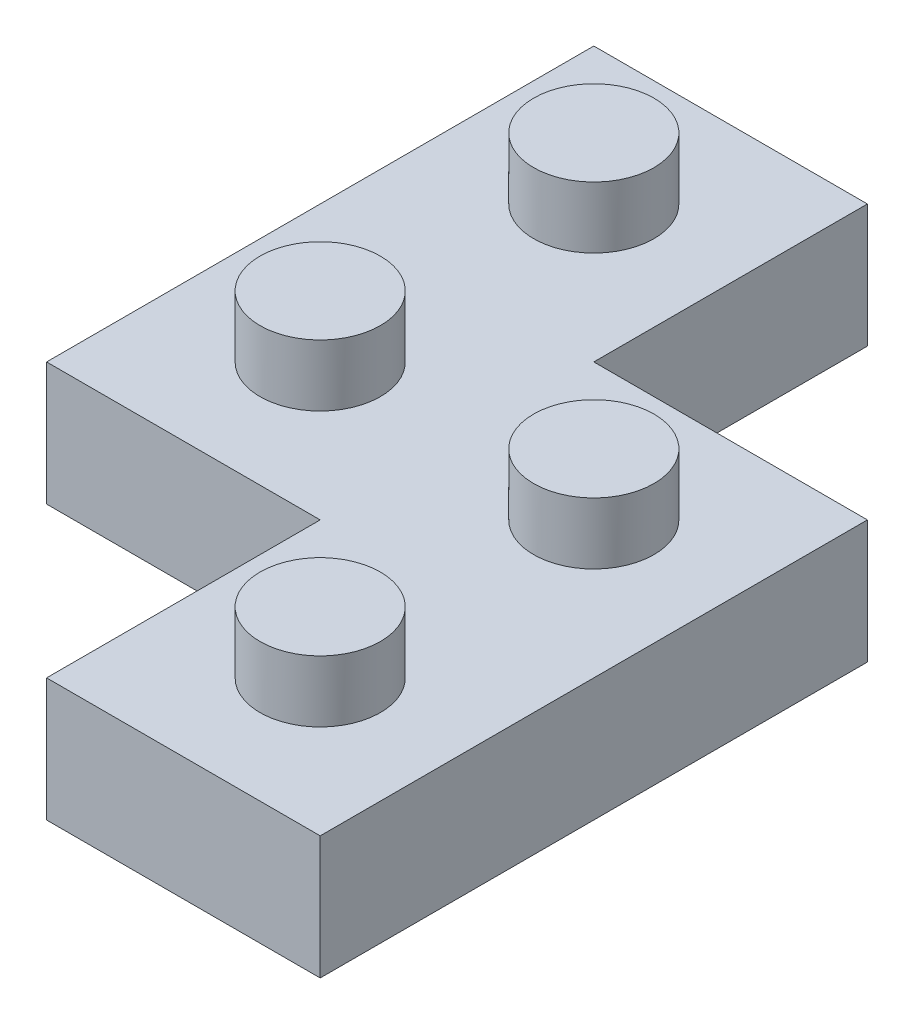
ISO-10303-21;
HEADER;
FILE_DESCRIPTION(('STEP AP214'),'2;1');
FILE_NAME('part.step','',(''),(''),'','','');
FILE_SCHEMA(('AUTOMOTIVE_DESIGN { 1 0 10303 214 1 1 1 1 }'));
ENDSEC;
DATA;
#1=APPLICATION_CONTEXT('core data for automotive mechanical design processes');
#2=APPLICATION_PROTOCOL_DEFINITION('international standard','automotive_design',2000,#1);
#3=PRODUCT_CONTEXT('',#1,'mechanical');
#4=PRODUCT('Part','Part','',(#3));
#5=PRODUCT_RELATED_PRODUCT_CATEGORY('part','',(#4));
#6=PRODUCT_DEFINITION_FORMATION('','',#4);
#7=PRODUCT_DEFINITION_CONTEXT('part definition',#1,'design');
#8=PRODUCT_DEFINITION('design','',#6,#7);
#9=PRODUCT_DEFINITION_SHAPE('','',#8);
#10=(LENGTH_UNIT() NAMED_UNIT(*) SI_UNIT(.MILLI.,.METRE.));
#11=(NAMED_UNIT(*) PLANE_ANGLE_UNIT() SI_UNIT($,.RADIAN.));
#12=(NAMED_UNIT(*) SI_UNIT($,.STERADIAN.) SOLID_ANGLE_UNIT());
#13=UNCERTAINTY_MEASURE_WITH_UNIT(LENGTH_MEASURE(1.E-05),#10,'distance_accuracy_value','');
#14=(GEOMETRIC_REPRESENTATION_CONTEXT(3) GLOBAL_UNCERTAINTY_ASSIGNED_CONTEXT((#13)) GLOBAL_UNIT_ASSIGNED_CONTEXT((#10,
#11,#12)) REPRESENTATION_CONTEXT('',''));
#15=CARTESIAN_POINT('',(0.,0.,0.));
#16=DIRECTION('',(0.,0.,1.));
#17=DIRECTION('',(1.,0.,0.));
#18=AXIS2_PLACEMENT_3D('',#15,#16,#17);
#19=CARTESIAN_POINT('',(-5.67459836559188,5.715,5.08878731258951));
#20=DIRECTION('',(1.,0.,0.));
#21=DIRECTION('',(0.,0.,-1.));
#22=AXIS2_PLACEMENT_3D('',#19,#20,#21);
#23=PLANE('',#22);
#24=DIRECTION('',(0.,0.,1.));
#25=VECTOR('',#24,1.);
#26=CARTESIAN_POINT('',(-5.67459836559188,0.,5.08878731258951));
#27=LINE('',#26,#25);
#28=CARTESIAN_POINT('',(-5.67459836559188,0.,-20.3112126874105));
#29=VERTEX_POINT('',#28);
#30=CARTESIAN_POINT('',(-5.67459836559188,0.,5.08878731258951));
#31=VERTEX_POINT('',#30);
#32=EDGE_CURVE('E131',#29,#31,#27,.T.);
#33=ORIENTED_EDGE('',*,*,#32,.T.);
#34=DIRECTION('',(0.,-1.,0.));
#35=VECTOR('',#34,1.);
#36=CARTESIAN_POINT('',(-5.67459836559188,5.715,5.08878731258951));
#37=LINE('',#36,#35);
#38=CARTESIAN_POINT('',(-5.67459836559188,5.715,5.08878731258951));
#39=VERTEX_POINT('',#38);
#40=EDGE_CURVE('E159',#39,#31,#37,.T.);
#41=ORIENTED_EDGE('',*,*,#40,.F.);
#42=DIRECTION('',(0.,0.,1.));
#43=VECTOR('',#42,1.);
#44=CARTESIAN_POINT('',(-5.67459836559188,5.715,5.08878731258951));
#45=LINE('',#44,#43);
#46=CARTESIAN_POINT('',(-5.67459836559188,5.715,-20.3112126874105));
#47=VERTEX_POINT('',#46);
#48=EDGE_CURVE('E146',#47,#39,#45,.T.);
#49=ORIENTED_EDGE('',*,*,#48,.F.);
#50=DIRECTION('',(0.,-1.,0.));
#51=VECTOR('',#50,1.);
#52=CARTESIAN_POINT('',(-5.67459836559188,5.715,-20.3112126874105));
#53=LINE('',#52,#51);
#54=EDGE_CURVE('E127',#47,#29,#53,.T.);
#55=ORIENTED_EDGE('',*,*,#54,.T.);
#56=EDGE_LOOP('',(#33,#41,#49,#55));
#57=FACE_BOUND('',#56,.T.);
#58=ADVANCED_FACE('F34',(#57),#23,.F.);
#59=CARTESIAN_POINT('',(7.02540163440812,5.715,5.08878731258951));
#60=DIRECTION('',(0.,0.,-1.));
#61=DIRECTION('',(-1.,0.,0.));
#62=AXIS2_PLACEMENT_3D('',#59,#60,#61);
#63=PLANE('',#62);
#64=DIRECTION('',(1.,0.,0.));
#65=VECTOR('',#64,1.);
#66=CARTESIAN_POINT('',(7.02540163440812,0.,5.08878731258951));
#67=LINE('',#66,#65);
#68=CARTESIAN_POINT('',(7.02540163440812,0.,5.08878731258951));
#69=VERTEX_POINT('',#68);
#70=EDGE_CURVE('E134',#31,#69,#67,.T.);
#71=ORIENTED_EDGE('',*,*,#70,.T.);
#72=DIRECTION('',(0.,-1.,0.));
#73=VECTOR('',#72,1.);
#74=CARTESIAN_POINT('',(7.02540163440812,5.715,5.08878731258951));
#75=LINE('',#74,#73);
#76=CARTESIAN_POINT('',(7.02540163440812,5.715,5.08878731258951));
#77=VERTEX_POINT('',#76);
#78=EDGE_CURVE('E156',#77,#69,#75,.T.);
#79=ORIENTED_EDGE('',*,*,#78,.F.);
#80=DIRECTION('',(1.,0.,0.));
#81=VECTOR('',#80,1.);
#82=CARTESIAN_POINT('',(7.02540163440812,5.715,5.08878731258951));
#83=LINE('',#82,#81);
#84=EDGE_CURVE('E94',#39,#77,#83,.T.);
#85=ORIENTED_EDGE('',*,*,#84,.F.);
#86=ORIENTED_EDGE('',*,*,#40,.T.);
#87=EDGE_LOOP('',(#71,#79,#85,#86));
#88=FACE_BOUND('',#87,.T.);
#89=ADVANCED_FACE('F197',(#88),#63,.F.);
#90=CARTESIAN_POINT('',(7.02540163440812,5.715,17.7887873125895));
#91=DIRECTION('',(1.,0.,0.));
#92=DIRECTION('',(0.,0.,-1.));
#93=AXIS2_PLACEMENT_3D('',#90,#91,#92);
#94=PLANE('',#93);
#95=DIRECTION('',(0.,0.,1.));
#96=VECTOR('',#95,1.);
#97=CARTESIAN_POINT('',(7.02540163440812,0.,17.7887873125895));
#98=LINE('',#97,#96);
#99=CARTESIAN_POINT('',(7.02540163440812,0.,17.7887873125895));
#100=VERTEX_POINT('',#99);
#101=EDGE_CURVE('E137',#69,#100,#98,.T.);
#102=ORIENTED_EDGE('',*,*,#101,.T.);
#103=DIRECTION('',(0.,-1.,0.));
#104=VECTOR('',#103,1.);
#105=CARTESIAN_POINT('',(7.02540163440812,5.715,17.7887873125895));
#106=LINE('',#105,#104);
#107=CARTESIAN_POINT('',(7.02540163440812,5.715,17.7887873125895));
#108=VERTEX_POINT('',#107);
#109=EDGE_CURVE('E153',#108,#100,#106,.T.);
#110=ORIENTED_EDGE('',*,*,#109,.F.);
#111=DIRECTION('',(0.,0.,1.));
#112=VECTOR('',#111,1.);
#113=CARTESIAN_POINT('',(7.02540163440812,5.715,17.7887873125895));
#114=LINE('',#113,#112);
#115=EDGE_CURVE('E211',#77,#108,#114,.T.);
#116=ORIENTED_EDGE('',*,*,#115,.F.);
#117=ORIENTED_EDGE('',*,*,#78,.T.);
#118=EDGE_LOOP('',(#102,#110,#116,#117));
#119=FACE_BOUND('',#118,.T.);
#120=ADVANCED_FACE('F202',(#119),#94,.F.);
#121=CARTESIAN_POINT('',(19.7254016344081,5.715,17.7887873125895));
#122=DIRECTION('',(0.,0.,-1.));
#123=DIRECTION('',(-1.,0.,0.));
#124=AXIS2_PLACEMENT_3D('',#121,#122,#123);
#125=PLANE('',#124);
#126=DIRECTION('',(1.,0.,0.));
#127=VECTOR('',#126,1.);
#128=CARTESIAN_POINT('',(19.7254016344081,0.,17.7887873125895));
#129=LINE('',#128,#127);
#130=CARTESIAN_POINT('',(19.7254016344081,0.,17.7887873125895));
#131=VERTEX_POINT('',#130);
#132=EDGE_CURVE('E139',#100,#131,#129,.T.);
#133=ORIENTED_EDGE('',*,*,#132,.T.);
#134=DIRECTION('',(0.,-1.,0.));
#135=VECTOR('',#134,1.);
#136=CARTESIAN_POINT('',(19.7254016344081,5.715,17.7887873125895));
#137=LINE('',#136,#135);
#138=CARTESIAN_POINT('',(19.7254016344081,5.715,17.7887873125895));
#139=VERTEX_POINT('',#138);
#140=EDGE_CURVE('E150',#139,#131,#137,.T.);
#141=ORIENTED_EDGE('',*,*,#140,.F.);
#142=DIRECTION('',(1.,0.,0.));
#143=VECTOR('',#142,1.);
#144=CARTESIAN_POINT('',(19.7254016344081,5.715,17.7887873125895));
#145=LINE('',#144,#143);
#146=EDGE_CURVE('E213',#108,#139,#145,.T.);
#147=ORIENTED_EDGE('',*,*,#146,.F.);
#148=ORIENTED_EDGE('',*,*,#109,.T.);
#149=EDGE_LOOP('',(#133,#141,#147,#148));
#150=FACE_BOUND('',#149,.T.);
#151=ADVANCED_FACE('F340',(#150),#125,.F.);
#152=CARTESIAN_POINT('',(19.7254016344081,5.715,-7.61121268741049));
#153=DIRECTION('',(-1.,0.,0.));
#154=DIRECTION('',(0.,0.,1.));
#155=AXIS2_PLACEMENT_3D('',#152,#153,#154);
#156=PLANE('',#155);
#157=DIRECTION('',(0.,0.,-1.));
#158=VECTOR('',#157,1.);
#159=CARTESIAN_POINT('',(19.7254016344081,0.,-7.61121268741049));
#160=LINE('',#159,#158);
#161=CARTESIAN_POINT('',(19.7254016344081,0.,-7.61121268741049));
#162=VERTEX_POINT('',#161);
#163=EDGE_CURVE('E141',#131,#162,#160,.T.);
#164=ORIENTED_EDGE('',*,*,#163,.T.);
#165=DIRECTION('',(0.,-1.,0.));
#166=VECTOR('',#165,1.);
#167=CARTESIAN_POINT('',(19.7254016344081,5.715,-7.61121268741049));
#168=LINE('',#167,#166);
#169=CARTESIAN_POINT('',(19.7254016344081,5.715,-7.61121268741049));
#170=VERTEX_POINT('',#169);
#171=EDGE_CURVE('E122',#170,#162,#168,.T.);
#172=ORIENTED_EDGE('',*,*,#171,.F.);
#173=DIRECTION('',(0.,0.,-1.));
#174=VECTOR('',#173,1.);
#175=CARTESIAN_POINT('',(19.7254016344081,5.715,-7.61121268741049));
#176=LINE('',#175,#174);
#177=EDGE_CURVE('E113',#139,#170,#176,.T.);
#178=ORIENTED_EDGE('',*,*,#177,.F.);
#179=ORIENTED_EDGE('',*,*,#140,.T.);
#180=EDGE_LOOP('',(#164,#172,#178,#179));
#181=FACE_BOUND('',#180,.T.);
#182=ADVANCED_FACE('F332',(#181),#156,.F.);
#183=CARTESIAN_POINT('',(7.02540163440812,5.715,-7.61121268741049));
#184=DIRECTION('',(0.,0.,1.));
#185=DIRECTION('',(1.,0.,0.));
#186=AXIS2_PLACEMENT_3D('',#183,#184,#185);
#187=PLANE('',#186);
#188=DIRECTION('',(-1.,0.,0.));
#189=VECTOR('',#188,1.);
#190=CARTESIAN_POINT('',(7.02540163440812,0.,-7.61121268741049));
#191=LINE('',#190,#189);
#192=CARTESIAN_POINT('',(7.02540163440812,0.,-7.61121268741049));
#193=VERTEX_POINT('',#192);
#194=EDGE_CURVE('E121',#162,#193,#191,.T.);
#195=ORIENTED_EDGE('',*,*,#194,.T.);
#196=DIRECTION('',(0.,-1.,0.));
#197=VECTOR('',#196,1.);
#198=CARTESIAN_POINT('',(7.02540163440812,5.715,-7.61121268741049));
#199=LINE('',#198,#197);
#200=CARTESIAN_POINT('',(7.02540163440812,5.715,-7.61121268741049));
#201=VERTEX_POINT('',#200);
#202=EDGE_CURVE('E118',#201,#193,#199,.T.);
#203=ORIENTED_EDGE('',*,*,#202,.F.);
#204=DIRECTION('',(-1.,0.,0.));
#205=VECTOR('',#204,1.);
#206=CARTESIAN_POINT('',(7.02540163440812,5.715,-7.61121268741049));
#207=LINE('',#206,#205);
#208=EDGE_CURVE('E107',#170,#201,#207,.T.);
#209=ORIENTED_EDGE('',*,*,#208,.F.);
#210=ORIENTED_EDGE('',*,*,#171,.T.);
#211=EDGE_LOOP('',(#195,#203,#209,#210));
#212=FACE_BOUND('',#211,.T.);
#213=ADVANCED_FACE('F119',(#212),#187,.F.);
#214=CARTESIAN_POINT('',(7.02540163440812,5.715,-20.3112126874105));
#215=DIRECTION('',(-1.,0.,0.));
#216=DIRECTION('',(0.,0.,1.));
#217=AXIS2_PLACEMENT_3D('',#214,#215,#216);
#218=PLANE('',#217);
#219=DIRECTION('',(0.,0.,-1.));
#220=VECTOR('',#219,1.);
#221=CARTESIAN_POINT('',(7.02540163440812,0.,-20.3112126874105));
#222=LINE('',#221,#220);
#223=CARTESIAN_POINT('',(7.02540163440812,0.,-20.3112126874105));
#224=VERTEX_POINT('',#223);
#225=EDGE_CURVE('E79',#193,#224,#222,.T.);
#226=ORIENTED_EDGE('',*,*,#225,.T.);
#227=DIRECTION('',(0.,-1.,0.));
#228=VECTOR('',#227,1.);
#229=CARTESIAN_POINT('',(7.02540163440812,5.715,-20.3112126874105));
#230=LINE('',#229,#228);
#231=CARTESIAN_POINT('',(7.02540163440812,5.715,-20.3112126874105));
#232=VERTEX_POINT('',#231);
#233=EDGE_CURVE('E123',#232,#224,#230,.T.);
#234=ORIENTED_EDGE('',*,*,#233,.F.);
#235=DIRECTION('',(0.,0.,-1.));
#236=VECTOR('',#235,1.);
#237=CARTESIAN_POINT('',(7.02540163440812,5.715,-20.3112126874105));
#238=LINE('',#237,#236);
#239=EDGE_CURVE('E111',#201,#232,#238,.T.);
#240=ORIENTED_EDGE('',*,*,#239,.F.);
#241=ORIENTED_EDGE('',*,*,#202,.T.);
#242=EDGE_LOOP('',(#226,#234,#240,#241));
#243=FACE_BOUND('',#242,.T.);
#244=ADVANCED_FACE('F125',(#243),#218,.F.);
#245=CARTESIAN_POINT('',(-5.67459836559188,5.715,-20.3112126874105));
#246=DIRECTION('',(0.,0.,1.));
#247=DIRECTION('',(1.,0.,0.));
#248=AXIS2_PLACEMENT_3D('',#245,#246,#247);
#249=PLANE('',#248);
#250=DIRECTION('',(-1.,0.,0.));
#251=VECTOR('',#250,1.);
#252=CARTESIAN_POINT('',(-5.67459836559188,0.,-20.3112126874105));
#253=LINE('',#252,#251);
#254=EDGE_CURVE('E85',#224,#29,#253,.T.);
#255=ORIENTED_EDGE('',*,*,#254,.T.);
#256=ORIENTED_EDGE('',*,*,#54,.F.);
#257=DIRECTION('',(-1.,0.,0.));
#258=VECTOR('',#257,1.);
#259=CARTESIAN_POINT('',(-5.67459836559188,5.715,-20.3112126874105));
#260=LINE('',#259,#258);
#261=EDGE_CURVE('E50',#232,#47,#260,.T.);
#262=ORIENTED_EDGE('',*,*,#261,.F.);
#263=ORIENTED_EDGE('',*,*,#233,.T.);
#264=EDGE_LOOP('',(#255,#256,#262,#263));
#265=FACE_BOUND('',#264,.T.);
#266=ADVANCED_FACE('F174',(#265),#249,.F.);
#267=CARTESIAN_POINT('',(0.,5.715,0.));
#268=DIRECTION('',(0.,-1.,0.));
#269=DIRECTION('',(0.,0.,-1.));
#270=AXIS2_PLACEMENT_3D('',#267,#268,#269);
#271=PLANE('',#270);
#272=CARTESIAN_POINT('',(13.3754016344081,5.715,11.4387873125895));
#273=DIRECTION('',(0.,-1.,0.));
#274=DIRECTION('',(0.,0.,-1.));
#275=AXIS2_PLACEMENT_3D('',#272,#273,#274);
#276=CIRCLE('',#275,2.794);
#277=CARTESIAN_POINT('',(13.3754016344081,5.715,8.64478731258951));
#278=VERTEX_POINT('',#277);
#279=EDGE_CURVE('E11',#278,#278,#276,.F.);
#280=ORIENTED_EDGE('',*,*,#279,.F.);
#281=EDGE_LOOP('',(#280));
#282=FACE_BOUND('',#281,.T.);
#283=CARTESIAN_POINT('',(0.675401634408119,5.715,-13.9612126874105));
#284=DIRECTION('',(0.,-1.,0.));
#285=DIRECTION('',(0.,0.,-1.));
#286=AXIS2_PLACEMENT_3D('',#283,#284,#285);
#287=CIRCLE('',#286,2.794);
#288=CARTESIAN_POINT('',(0.675401634408119,5.715,-16.7552126874105));
#289=VERTEX_POINT('',#288);
#290=EDGE_CURVE('E42',#289,#289,#287,.F.);
#291=ORIENTED_EDGE('',*,*,#290,.F.);
#292=EDGE_LOOP('',(#291));
#293=FACE_BOUND('',#292,.T.);
#294=CARTESIAN_POINT('',(13.3754016344081,5.715,-1.26121268741049));
#295=DIRECTION('',(0.,-1.,0.));
#296=DIRECTION('',(0.,0.,-1.));
#297=AXIS2_PLACEMENT_3D('',#294,#295,#296);
#298=CIRCLE('',#297,2.79399999999999);
#299=CARTESIAN_POINT('',(13.3754016344081,5.715,-4.05521268741048));
#300=VERTEX_POINT('',#299);
#301=EDGE_CURVE('E164',#300,#300,#298,.F.);
#302=ORIENTED_EDGE('',*,*,#301,.F.);
#303=EDGE_LOOP('',(#302));
#304=FACE_BOUND('',#303,.T.);
#305=CARTESIAN_POINT('',(0.675401634408119,5.715,-1.26121268741049));
#306=DIRECTION('',(0.,-1.,0.));
#307=DIRECTION('',(0.,0.,-1.));
#308=AXIS2_PLACEMENT_3D('',#305,#306,#307);
#309=CIRCLE('',#308,2.79399999999999);
#310=CARTESIAN_POINT('',(0.675401634408119,5.715,-4.05521268741048));
#311=VERTEX_POINT('',#310);
#312=EDGE_CURVE('E161',#311,#311,#309,.F.);
#313=ORIENTED_EDGE('',*,*,#312,.F.);
#314=EDGE_LOOP('',(#313));
#315=FACE_BOUND('',#314,.T.);
#316=ORIENTED_EDGE('',*,*,#48,.T.);
#317=ORIENTED_EDGE('',*,*,#84,.T.);
#318=ORIENTED_EDGE('',*,*,#115,.T.);
#319=ORIENTED_EDGE('',*,*,#146,.T.);
#320=ORIENTED_EDGE('',*,*,#177,.T.);
#321=ORIENTED_EDGE('',*,*,#208,.T.);
#322=ORIENTED_EDGE('',*,*,#239,.T.);
#323=ORIENTED_EDGE('',*,*,#261,.T.);
#324=EDGE_LOOP('',(#316,#317,#318,#319,#320,#321,#322,#323));
#325=FACE_BOUND('',#324,.T.);
#326=ADVANCED_FACE('F109',(#282,#293,#304,#315,#325),#271,.F.);
#327=CARTESIAN_POINT('',(0.,0.,0.));
#328=DIRECTION('',(0.,-1.,0.));
#329=DIRECTION('',(0.,0.,-1.));
#330=AXIS2_PLACEMENT_3D('',#327,#328,#329);
#331=PLANE('',#330);
#332=ORIENTED_EDGE('',*,*,#32,.F.);
#333=ORIENTED_EDGE('',*,*,#254,.F.);
#334=ORIENTED_EDGE('',*,*,#225,.F.);
#335=ORIENTED_EDGE('',*,*,#194,.F.);
#336=ORIENTED_EDGE('',*,*,#163,.F.);
#337=ORIENTED_EDGE('',*,*,#132,.F.);
#338=ORIENTED_EDGE('',*,*,#101,.F.);
#339=ORIENTED_EDGE('',*,*,#70,.F.);
#340=EDGE_LOOP('',(#332,#333,#334,#335,#336,#337,#338,#339));
#341=FACE_BOUND('',#340,.T.);
#342=ADVANCED_FACE('F173',(#341),#331,.T.);
#343=CARTESIAN_POINT('',(0.675401634408119,8.5725,-1.26121268741049));
#344=DIRECTION('',(0.,-1.,0.));
#345=DIRECTION('',(0.,0.,-1.));
#346=AXIS2_PLACEMENT_3D('',#343,#344,#345);
#347=CYLINDRICAL_SURFACE('',#346,2.79399999999999);
#348=CARTESIAN_POINT('',(0.675401634408119,8.5725,-1.26121268741049));
#349=DIRECTION('',(0.,1.,0.));
#350=DIRECTION('',(0.,0.,1.));
#351=AXIS2_PLACEMENT_3D('',#348,#349,#350);
#352=CIRCLE('',#351,2.79399999999999);
#353=CARTESIAN_POINT('',(0.675401634408119,8.5725,1.5327873125895));
#354=VERTEX_POINT('',#353);
#355=EDGE_CURVE('E135',#354,#354,#352,.T.);
#356=ORIENTED_EDGE('',*,*,#355,.F.);
#357=EDGE_LOOP('',(#356));
#358=FACE_BOUND('',#357,.T.);
#359=ORIENTED_EDGE('',*,*,#312,.T.);
#360=EDGE_LOOP('',(#359));
#361=FACE_BOUND('',#360,.T.);
#362=ADVANCED_FACE('F181',(#358,#361),#347,.T.);
#363=CARTESIAN_POINT('',(0.675401634408119,8.5725,-1.26121268741049));
#364=DIRECTION('',(0.,1.,0.));
#365=DIRECTION('',(0.,0.,1.));
#366=AXIS2_PLACEMENT_3D('',#363,#364,#365);
#367=PLANE('',#366);
#368=ORIENTED_EDGE('',*,*,#355,.T.);
#369=EDGE_LOOP('',(#368));
#370=FACE_BOUND('',#369,.T.);
#371=ADVANCED_FACE('F183',(#370),#367,.T.);
#372=CARTESIAN_POINT('',(13.3754016344081,8.5725,-1.26121268741049));
#373=DIRECTION('',(0.,-1.,0.));
#374=DIRECTION('',(0.,0.,-1.));
#375=AXIS2_PLACEMENT_3D('',#372,#373,#374);
#376=CYLINDRICAL_SURFACE('',#375,2.79399999999999);
#377=CARTESIAN_POINT('',(13.3754016344081,8.5725,-1.26121268741049));
#378=DIRECTION('',(0.,1.,0.));
#379=DIRECTION('',(0.,0.,1.));
#380=AXIS2_PLACEMENT_3D('',#377,#378,#379);
#381=CIRCLE('',#380,2.79399999999999);
#382=CARTESIAN_POINT('',(13.3754016344081,8.5725,1.5327873125895));
#383=VERTEX_POINT('',#382);
#384=EDGE_CURVE('E221',#383,#383,#381,.T.);
#385=ORIENTED_EDGE('',*,*,#384,.F.);
#386=EDGE_LOOP('',(#385));
#387=FACE_BOUND('',#386,.T.);
#388=ORIENTED_EDGE('',*,*,#301,.T.);
#389=EDGE_LOOP('',(#388));
#390=FACE_BOUND('',#389,.T.);
#391=ADVANCED_FACE('F190',(#387,#390),#376,.T.);
#392=CARTESIAN_POINT('',(13.3754016344081,8.5725,-1.26121268741049));
#393=DIRECTION('',(0.,1.,0.));
#394=DIRECTION('',(0.,0.,1.));
#395=AXIS2_PLACEMENT_3D('',#392,#393,#394);
#396=PLANE('',#395);
#397=ORIENTED_EDGE('',*,*,#384,.T.);
#398=EDGE_LOOP('',(#397));
#399=FACE_BOUND('',#398,.T.);
#400=ADVANCED_FACE('F249',(#399),#396,.T.);
#401=CARTESIAN_POINT('',(0.675401634408119,8.5725,-13.9612126874105));
#402=DIRECTION('',(0.,-1.,0.));
#403=DIRECTION('',(0.,0.,-1.));
#404=AXIS2_PLACEMENT_3D('',#401,#402,#403);
#405=CYLINDRICAL_SURFACE('',#404,2.794);
#406=CARTESIAN_POINT('',(0.675401634408119,8.5725,-13.9612126874105));
#407=DIRECTION('',(0.,1.,0.));
#408=DIRECTION('',(0.,0.,1.));
#409=AXIS2_PLACEMENT_3D('',#406,#407,#408);
#410=CIRCLE('',#409,2.794);
#411=CARTESIAN_POINT('',(0.675401634408119,8.5725,-11.1672126874105));
#412=VERTEX_POINT('',#411);
#413=EDGE_CURVE('E224',#412,#412,#410,.T.);
#414=ORIENTED_EDGE('',*,*,#413,.F.);
#415=EDGE_LOOP('',(#414));
#416=FACE_BOUND('',#415,.T.);
#417=ORIENTED_EDGE('',*,*,#290,.T.);
#418=EDGE_LOOP('',(#417));
#419=FACE_BOUND('',#418,.T.);
#420=ADVANCED_FACE('F169',(#416,#419),#405,.T.);
#421=CARTESIAN_POINT('',(0.675401634408119,8.5725,-13.9612126874105));
#422=DIRECTION('',(0.,1.,0.));
#423=DIRECTION('',(0.,0.,1.));
#424=AXIS2_PLACEMENT_3D('',#421,#422,#423);
#425=PLANE('',#424);
#426=ORIENTED_EDGE('',*,*,#413,.T.);
#427=EDGE_LOOP('',(#426));
#428=FACE_BOUND('',#427,.T.);
#429=ADVANCED_FACE('F236',(#428),#425,.T.);
#430=CARTESIAN_POINT('',(13.3754016344081,8.5725,11.4387873125895));
#431=DIRECTION('',(0.,-1.,0.));
#432=DIRECTION('',(0.,0.,-1.));
#433=AXIS2_PLACEMENT_3D('',#430,#431,#432);
#434=CYLINDRICAL_SURFACE('',#433,2.794);
#435=CARTESIAN_POINT('',(13.3754016344081,8.5725,11.4387873125895));
#436=DIRECTION('',(0.,1.,0.));
#437=DIRECTION('',(0.,0.,1.));
#438=AXIS2_PLACEMENT_3D('',#435,#436,#437);
#439=CIRCLE('',#438,2.794);
#440=CARTESIAN_POINT('',(13.3754016344081,8.5725,14.2327873125895));
#441=VERTEX_POINT('',#440);
#442=EDGE_CURVE('E227',#441,#441,#439,.T.);
#443=ORIENTED_EDGE('',*,*,#442,.F.);
#444=EDGE_LOOP('',(#443));
#445=FACE_BOUND('',#444,.T.);
#446=ORIENTED_EDGE('',*,*,#279,.T.);
#447=EDGE_LOOP('',(#446));
#448=FACE_BOUND('',#447,.T.);
#449=ADVANCED_FACE('F233',(#445,#448),#434,.T.);
#450=CARTESIAN_POINT('',(13.3754016344081,8.5725,11.4387873125895));
#451=DIRECTION('',(0.,1.,0.));
#452=DIRECTION('',(0.,0.,1.));
#453=AXIS2_PLACEMENT_3D('',#450,#451,#452);
#454=PLANE('',#453);
#455=ORIENTED_EDGE('',*,*,#442,.T.);
#456=EDGE_LOOP('',(#455));
#457=FACE_BOUND('',#456,.T.);
#458=ADVANCED_FACE('F231',(#457),#454,.T.);
#459=CLOSED_SHELL('',(#58,#89,#120,#151,#182,#213,#244,#266,#326,#342,#362,#371,#391,#400,#420,
#429,#449,#458));
#460=MANIFOLD_SOLID_BREP('B2',#459);
#461=ADVANCED_BREP_SHAPE_REPRESENTATION('',(#18,#460),#14);
#462=SHAPE_DEFINITION_REPRESENTATION(#9,#461);
ENDSEC;
END-ISO-10303-21;
